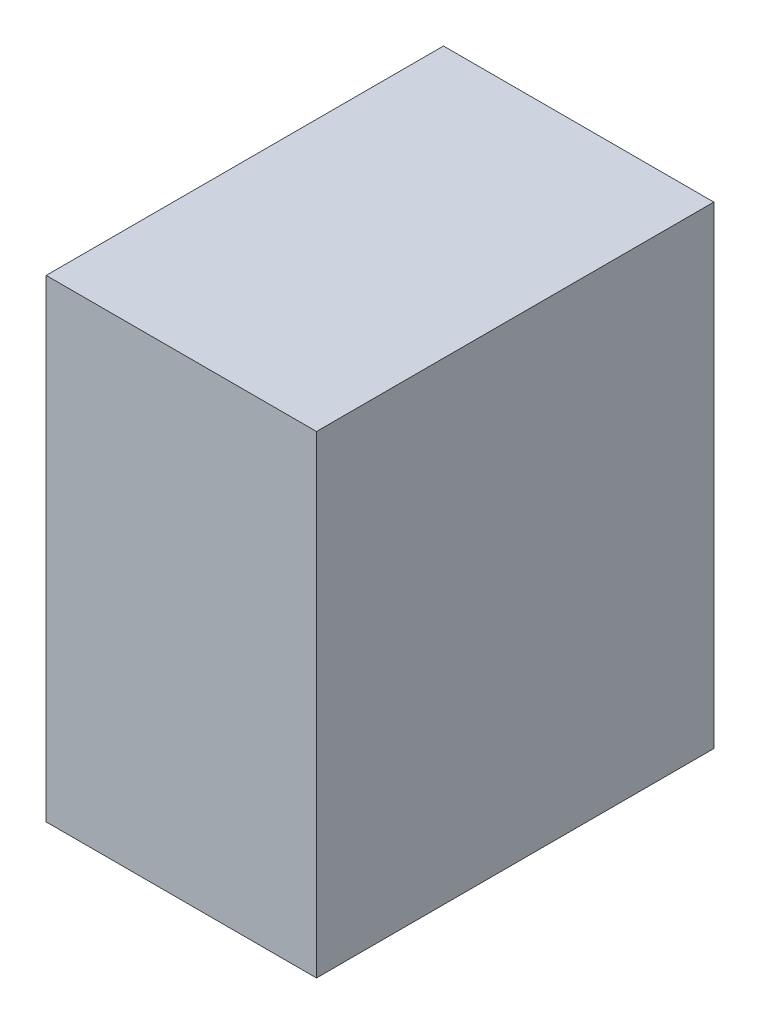
ISO-10303-21;
HEADER;
FILE_DESCRIPTION(('STEP AP214'),'2;1');
FILE_NAME('part.step','',(''),(''),'','','');
FILE_SCHEMA(('AUTOMOTIVE_DESIGN { 1 0 10303 214 1 1 1 1 }'));
ENDSEC;
DATA;
#1=APPLICATION_CONTEXT('core data for automotive mechanical design processes');
#2=APPLICATION_PROTOCOL_DEFINITION('international standard','automotive_design',2000,#1);
#3=PRODUCT_CONTEXT('',#1,'mechanical');
#4=PRODUCT('Part','Part','',(#3));
#5=PRODUCT_RELATED_PRODUCT_CATEGORY('part','',(#4));
#6=PRODUCT_DEFINITION_FORMATION('','',#4);
#7=PRODUCT_DEFINITION_CONTEXT('part definition',#1,'design');
#8=PRODUCT_DEFINITION('design','',#6,#7);
#9=PRODUCT_DEFINITION_SHAPE('','',#8);
#10=(LENGTH_UNIT() NAMED_UNIT(*) SI_UNIT(.MILLI.,.METRE.));
#11=(NAMED_UNIT(*) PLANE_ANGLE_UNIT() SI_UNIT($,.RADIAN.));
#12=(NAMED_UNIT(*) SI_UNIT($,.STERADIAN.) SOLID_ANGLE_UNIT());
#13=UNCERTAINTY_MEASURE_WITH_UNIT(LENGTH_MEASURE(1.E-05),#10,'distance_accuracy_value','');
#14=(GEOMETRIC_REPRESENTATION_CONTEXT(3) GLOBAL_UNCERTAINTY_ASSIGNED_CONTEXT((#13)) GLOBAL_UNIT_ASSIGNED_CONTEXT((#10,
#11,#12)) REPRESENTATION_CONTEXT('',''));
#15=CARTESIAN_POINT('',(0.,0.,0.));
#16=DIRECTION('',(0.,0.,1.));
#17=DIRECTION('',(1.,0.,0.));
#18=AXIS2_PLACEMENT_3D('',#15,#16,#17);
#19=CARTESIAN_POINT('',(-13.6984716132696,-29.1967520239699,27.3733769144023));
#20=DIRECTION('',(0.,0.,-1.));
#21=DIRECTION('',(-1.,0.,0.));
#22=AXIS2_PLACEMENT_3D('',#19,#20,#21);
#23=PLANE('',#22);
#24=DIRECTION('',(0.,-1.,0.));
#25=VECTOR('',#24,1.);
#26=CARTESIAN_POINT('',(-13.7934716132696,-29.1967520239699,27.3733769144023));
#27=LINE('',#26,#25);
#28=CARTESIAN_POINT('',(-13.7934716132696,-29.030427938253,27.3733769144023));
#29=VERTEX_POINT('',#28);
#30=CARTESIAN_POINT('',(-13.7934716132696,-29.1967520239699,27.3733769144023));
#31=VERTEX_POINT('',#30);
#32=EDGE_CURVE('E96',#29,#31,#27,.T.);
#33=ORIENTED_EDGE('',*,*,#32,.T.);
#34=DIRECTION('',(-1.,0.,0.));
#35=VECTOR('',#34,1.);
#36=CARTESIAN_POINT('',(-13.6984716132696,-29.1967520239699,27.3733769144023));
#37=LINE('',#36,#35);
#38=CARTESIAN_POINT('',(-13.6984716132696,-29.1967520239699,27.3733769144023));
#39=VERTEX_POINT('',#38);
#40=EDGE_CURVE('E11',#39,#31,#37,.T.);
#41=ORIENTED_EDGE('',*,*,#40,.F.);
#42=DIRECTION('',(0.,-1.,0.));
#43=VECTOR('',#42,1.);
#44=CARTESIAN_POINT('',(-13.6984716132696,-29.1967520239699,27.3733769144023));
#45=LINE('',#44,#43);
#46=CARTESIAN_POINT('',(-13.6984716132696,-29.030427938253,27.3733769144023));
#47=VERTEX_POINT('',#46);
#48=EDGE_CURVE('E84',#47,#39,#45,.T.);
#49=ORIENTED_EDGE('',*,*,#48,.F.);
#50=DIRECTION('',(-1.,0.,0.));
#51=VECTOR('',#50,1.);
#52=CARTESIAN_POINT('',(-13.6984716132696,-29.030427938253,27.3733769144023));
#53=LINE('',#52,#51);
#54=EDGE_CURVE('E92',#47,#29,#53,.T.);
#55=ORIENTED_EDGE('',*,*,#54,.T.);
#56=EDGE_LOOP('',(#33,#41,#49,#55));
#57=FACE_BOUND('',#56,.T.);
#58=ADVANCED_FACE('F33',(#57),#23,.F.);
#59=CARTESIAN_POINT('',(-13.6984716132696,-29.1967520239699,27.3733769144023));
#60=DIRECTION('',(0.,1.,0.));
#61=DIRECTION('',(0.,0.,1.));
#62=AXIS2_PLACEMENT_3D('',#59,#60,#61);
#63=PLANE('',#62);
#64=DIRECTION('',(0.,0.,-1.));
#65=VECTOR('',#64,1.);
#66=CARTESIAN_POINT('',(-13.7934716132696,-29.1967520239699,27.3733769144023));
#67=LINE('',#66,#65);
#68=CARTESIAN_POINT('',(-13.7934716132696,-29.1967520239699,27.2337516015184));
#69=VERTEX_POINT('',#68);
#70=EDGE_CURVE('E88',#31,#69,#67,.T.);
#71=ORIENTED_EDGE('',*,*,#70,.T.);
#72=DIRECTION('',(-1.,0.,0.));
#73=VECTOR('',#72,1.);
#74=CARTESIAN_POINT('',(-13.6984716132696,-29.1967520239699,27.2337516015184));
#75=LINE('',#74,#73);
#76=CARTESIAN_POINT('',(-13.6984716132696,-29.1967520239699,27.2337516015184));
#77=VERTEX_POINT('',#76);
#78=EDGE_CURVE('E41',#77,#69,#75,.T.);
#79=ORIENTED_EDGE('',*,*,#78,.F.);
#80=DIRECTION('',(0.,0.,-1.));
#81=VECTOR('',#80,1.);
#82=CARTESIAN_POINT('',(-13.6984716132696,-29.1967520239699,27.3733769144023));
#83=LINE('',#82,#81);
#84=EDGE_CURVE('E79',#39,#77,#83,.T.);
#85=ORIENTED_EDGE('',*,*,#84,.F.);
#86=ORIENTED_EDGE('',*,*,#40,.T.);
#87=EDGE_LOOP('',(#71,#79,#85,#86));
#88=FACE_BOUND('',#87,.T.);
#89=ADVANCED_FACE('F87',(#88),#63,.F.);
#90=CARTESIAN_POINT('',(-13.6984716132696,-29.1967520239699,27.2337516015184));
#91=DIRECTION('',(0.,0.,1.));
#92=DIRECTION('',(1.,0.,0.));
#93=AXIS2_PLACEMENT_3D('',#90,#91,#92);
#94=PLANE('',#93);
#95=DIRECTION('',(0.,1.,0.));
#96=VECTOR('',#95,1.);
#97=CARTESIAN_POINT('',(-13.7934716132696,-29.1967520239699,27.2337516015184));
#98=LINE('',#97,#96);
#99=CARTESIAN_POINT('',(-13.7934716132696,-29.030427938253,27.2337516015184));
#100=VERTEX_POINT('',#99);
#101=EDGE_CURVE('E66',#69,#100,#98,.T.);
#102=ORIENTED_EDGE('',*,*,#101,.T.);
#103=DIRECTION('',(-1.,0.,0.));
#104=VECTOR('',#103,1.);
#105=CARTESIAN_POINT('',(-13.6984716132696,-29.030427938253,27.2337516015184));
#106=LINE('',#105,#104);
#107=CARTESIAN_POINT('',(-13.6984716132696,-29.030427938253,27.2337516015184));
#108=VERTEX_POINT('',#107);
#109=EDGE_CURVE('E89',#108,#100,#106,.T.);
#110=ORIENTED_EDGE('',*,*,#109,.F.);
#111=DIRECTION('',(0.,1.,0.));
#112=VECTOR('',#111,1.);
#113=CARTESIAN_POINT('',(-13.6984716132696,-29.1967520239699,27.2337516015184));
#114=LINE('',#113,#112);
#115=EDGE_CURVE('E82',#77,#108,#114,.T.);
#116=ORIENTED_EDGE('',*,*,#115,.F.);
#117=ORIENTED_EDGE('',*,*,#78,.T.);
#118=EDGE_LOOP('',(#102,#110,#116,#117));
#119=FACE_BOUND('',#118,.T.);
#120=ADVANCED_FACE('F90',(#119),#94,.F.);
#121=CARTESIAN_POINT('',(-13.6984716132696,-29.030427938253,27.3733769144023));
#122=DIRECTION('',(0.,-1.,0.));
#123=DIRECTION('',(0.,0.,-1.));
#124=AXIS2_PLACEMENT_3D('',#121,#122,#123);
#125=PLANE('',#124);
#126=DIRECTION('',(0.,0.,1.));
#127=VECTOR('',#126,1.);
#128=CARTESIAN_POINT('',(-13.7934716132696,-29.030427938253,27.3733769144023));
#129=LINE('',#128,#127);
#130=EDGE_CURVE('E72',#100,#29,#129,.T.);
#131=ORIENTED_EDGE('',*,*,#130,.T.);
#132=ORIENTED_EDGE('',*,*,#54,.F.);
#133=DIRECTION('',(0.,0.,1.));
#134=VECTOR('',#133,1.);
#135=CARTESIAN_POINT('',(-13.6984716132696,-29.030427938253,27.3733769144023));
#136=LINE('',#135,#134);
#137=EDGE_CURVE('E49',#108,#47,#136,.T.);
#138=ORIENTED_EDGE('',*,*,#137,.F.);
#139=ORIENTED_EDGE('',*,*,#109,.T.);
#140=EDGE_LOOP('',(#131,#132,#138,#139));
#141=FACE_BOUND('',#140,.T.);
#142=ADVANCED_FACE('F103',(#141),#125,.F.);
#143=CARTESIAN_POINT('',(-13.6984716132696,0.,0.));
#144=DIRECTION('',(-1.,0.,0.));
#145=DIRECTION('',(0.,0.,1.));
#146=AXIS2_PLACEMENT_3D('',#143,#144,#145);
#147=PLANE('',#146);
#148=ORIENTED_EDGE('',*,*,#48,.T.);
#149=ORIENTED_EDGE('',*,*,#84,.T.);
#150=ORIENTED_EDGE('',*,*,#115,.T.);
#151=ORIENTED_EDGE('',*,*,#137,.T.);
#152=EDGE_LOOP('',(#148,#149,#150,#151));
#153=FACE_BOUND('',#152,.T.);
#154=ADVANCED_FACE('F80',(#153),#147,.F.);
#155=CARTESIAN_POINT('',(-13.7934716132696,0.,0.));
#156=DIRECTION('',(-1.,0.,0.));
#157=DIRECTION('',(0.,0.,1.));
#158=AXIS2_PLACEMENT_3D('',#155,#156,#157);
#159=PLANE('',#158);
#160=ORIENTED_EDGE('',*,*,#32,.F.);
#161=ORIENTED_EDGE('',*,*,#130,.F.);
#162=ORIENTED_EDGE('',*,*,#101,.F.);
#163=ORIENTED_EDGE('',*,*,#70,.F.);
#164=EDGE_LOOP('',(#160,#161,#162,#163));
#165=FACE_BOUND('',#164,.T.);
#166=ADVANCED_FACE('F106',(#165),#159,.T.);
#167=CLOSED_SHELL('',(#58,#89,#120,#142,#154,#166));
#168=MANIFOLD_SOLID_BREP('B2',#167);
#169=ADVANCED_BREP_SHAPE_REPRESENTATION('',(#18,#168),#14);
#170=SHAPE_DEFINITION_REPRESENTATION(#9,#169);
ENDSEC;
END-ISO-10303-21;
